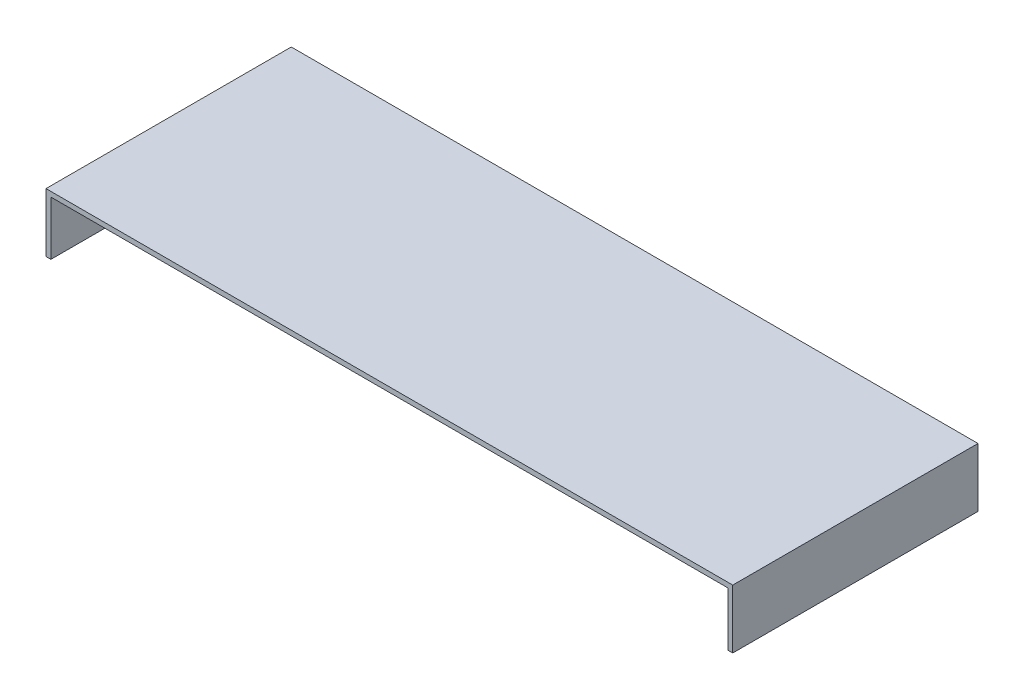
ISO-10303-21;
HEADER;
FILE_DESCRIPTION(('STEP AP214'),'2;1');
FILE_NAME('part.step','',(''),(''),'','','');
FILE_SCHEMA(('AUTOMOTIVE_DESIGN { 1 0 10303 214 1 1 1 1 }'));
ENDSEC;
DATA;
#1=APPLICATION_CONTEXT('core data for automotive mechanical design processes');
#2=APPLICATION_PROTOCOL_DEFINITION('international standard','automotive_design',2000,#1);
#3=PRODUCT_CONTEXT('',#1,'mechanical');
#4=PRODUCT('Part','Part','',(#3));
#5=PRODUCT_RELATED_PRODUCT_CATEGORY('part','',(#4));
#6=PRODUCT_DEFINITION_FORMATION('','',#4);
#7=PRODUCT_DEFINITION_CONTEXT('part definition',#1,'design');
#8=PRODUCT_DEFINITION('design','',#6,#7);
#9=PRODUCT_DEFINITION_SHAPE('','',#8);
#10=(LENGTH_UNIT() NAMED_UNIT(*) SI_UNIT(.MILLI.,.METRE.));
#11=(NAMED_UNIT(*) PLANE_ANGLE_UNIT() SI_UNIT($,.RADIAN.));
#12=(NAMED_UNIT(*) SI_UNIT($,.STERADIAN.) SOLID_ANGLE_UNIT());
#13=UNCERTAINTY_MEASURE_WITH_UNIT(LENGTH_MEASURE(1.E-05),#10,'distance_accuracy_value','');
#14=(GEOMETRIC_REPRESENTATION_CONTEXT(3) GLOBAL_UNCERTAINTY_ASSIGNED_CONTEXT((#13)) GLOBAL_UNIT_ASSIGNED_CONTEXT((#10,
#11,#12)) REPRESENTATION_CONTEXT('',''));
#15=CARTESIAN_POINT('',(0.,0.,0.));
#16=DIRECTION('',(0.,0.,1.));
#17=DIRECTION('',(1.,0.,0.));
#18=AXIS2_PLACEMENT_3D('',#15,#16,#17);
#19=CARTESIAN_POINT('',(0.,0.,0.));
#20=DIRECTION('',(0.,-1.,0.));
#21=DIRECTION('',(0.,0.,-1.));
#22=AXIS2_PLACEMENT_3D('',#19,#20,#21);
#23=PLANE('',#22);
#24=DIRECTION('',(0.,0.,1.));
#25=VECTOR('',#24,1.);
#26=CARTESIAN_POINT('',(-345.,0.,0.));
#27=LINE('',#26,#25);
#28=CARTESIAN_POINT('',(-345.,0.,-125.));
#29=VERTEX_POINT('',#28);
#30=CARTESIAN_POINT('',(-345.,0.,125.));
#31=VERTEX_POINT('',#30);
#32=EDGE_CURVE('E109',#29,#31,#27,.T.);
#33=ORIENTED_EDGE('',*,*,#32,.T.);
#34=DIRECTION('',(1.,0.,0.));
#35=VECTOR('',#34,1.);
#36=CARTESIAN_POINT('',(-350.,0.,125.));
#37=LINE('',#36,#35);
#38=CARTESIAN_POINT('',(-350.,0.,125.));
#39=VERTEX_POINT('',#38);
#40=EDGE_CURVE('E141',#39,#31,#37,.T.);
#41=ORIENTED_EDGE('',*,*,#40,.F.);
#42=DIRECTION('',(0.,0.,1.));
#43=VECTOR('',#42,1.);
#44=CARTESIAN_POINT('',(-350.,0.,125.));
#45=LINE('',#44,#43);
#46=CARTESIAN_POINT('',(-350.,0.,-125.));
#47=VERTEX_POINT('',#46);
#48=EDGE_CURVE('E68',#47,#39,#45,.T.);
#49=ORIENTED_EDGE('',*,*,#48,.F.);
#50=DIRECTION('',(-1.,0.,0.));
#51=VECTOR('',#50,1.);
#52=CARTESIAN_POINT('',(-350.,0.,-125.));
#53=LINE('',#52,#51);
#54=EDGE_CURVE('E124',#29,#47,#53,.T.);
#55=ORIENTED_EDGE('',*,*,#54,.F.);
#56=EDGE_LOOP('',(#33,#41,#49,#55));
#57=FACE_BOUND('',#56,.T.);
#58=ADVANCED_FACE('F33',(#57),#23,.T.);
#59=DIRECTION('',(0.,0.,-1.));
#60=VECTOR('',#59,1.);
#61=CARTESIAN_POINT('',(345.,0.,0.));
#62=LINE('',#61,#60);
#63=CARTESIAN_POINT('',(345.,0.,125.));
#64=VERTEX_POINT('',#63);
#65=CARTESIAN_POINT('',(345.,0.,-125.));
#66=VERTEX_POINT('',#65);
#67=EDGE_CURVE('E121',#64,#66,#62,.T.);
#68=ORIENTED_EDGE('',*,*,#67,.T.);
#69=CARTESIAN_POINT('',(350.,0.,-125.));
#70=VERTEX_POINT('',#69);
#71=EDGE_CURVE('E131',#70,#66,#53,.T.);
#72=ORIENTED_EDGE('',*,*,#71,.F.);
#73=DIRECTION('',(0.,0.,-1.));
#74=VECTOR('',#73,1.);
#75=CARTESIAN_POINT('',(350.,0.,125.));
#76=LINE('',#75,#74);
#77=CARTESIAN_POINT('',(350.,0.,125.));
#78=VERTEX_POINT('',#77);
#79=EDGE_CURVE('E132',#78,#70,#76,.T.);
#80=ORIENTED_EDGE('',*,*,#79,.F.);
#81=EDGE_CURVE('E75',#64,#78,#37,.T.);
#82=ORIENTED_EDGE('',*,*,#81,.F.);
#83=EDGE_LOOP('',(#68,#72,#80,#82));
#84=FACE_BOUND('',#83,.T.);
#85=ADVANCED_FACE('F187',(#84),#23,.T.);
#86=CARTESIAN_POINT('',(350.,60.,125.));
#87=DIRECTION('',(-1.,0.,0.));
#88=DIRECTION('',(0.,0.,1.));
#89=AXIS2_PLACEMENT_3D('',#86,#87,#88);
#90=PLANE('',#89);
#91=ORIENTED_EDGE('',*,*,#79,.T.);
#92=DIRECTION('',(0.,-1.,0.));
#93=VECTOR('',#92,1.);
#94=CARTESIAN_POINT('',(350.,60.,-125.));
#95=LINE('',#94,#93);
#96=CARTESIAN_POINT('',(350.,60.,-125.));
#97=VERTEX_POINT('',#96);
#98=EDGE_CURVE('E11',#97,#70,#95,.T.);
#99=ORIENTED_EDGE('',*,*,#98,.F.);
#100=DIRECTION('',(0.,0.,-1.));
#101=VECTOR('',#100,1.);
#102=CARTESIAN_POINT('',(350.,60.,125.));
#103=LINE('',#102,#101);
#104=CARTESIAN_POINT('',(350.,60.,125.));
#105=VERTEX_POINT('',#104);
#106=EDGE_CURVE('E143',#105,#97,#103,.T.);
#107=ORIENTED_EDGE('',*,*,#106,.F.);
#108=DIRECTION('',(0.,-1.,0.));
#109=VECTOR('',#108,1.);
#110=CARTESIAN_POINT('',(350.,60.,125.));
#111=LINE('',#110,#109);
#112=EDGE_CURVE('E144',#105,#78,#111,.T.);
#113=ORIENTED_EDGE('',*,*,#112,.T.);
#114=EDGE_LOOP('',(#91,#99,#107,#113));
#115=FACE_BOUND('',#114,.T.);
#116=ADVANCED_FACE('F35',(#115),#90,.F.);
#117=CARTESIAN_POINT('',(-350.,60.,-125.));
#118=DIRECTION('',(0.,0.,1.));
#119=DIRECTION('',(1.,0.,0.));
#120=AXIS2_PLACEMENT_3D('',#117,#118,#119);
#121=PLANE('',#120);
#122=DIRECTION('',(-1.,0.,0.));
#123=VECTOR('',#122,1.);
#124=CARTESIAN_POINT('',(-345.,55.,-125.));
#125=LINE('',#124,#123);
#126=CARTESIAN_POINT('',(345.,55.,-125.));
#127=VERTEX_POINT('',#126);
#128=CARTESIAN_POINT('',(-345.,55.,-125.));
#129=VERTEX_POINT('',#128);
#130=EDGE_CURVE('E127',#127,#129,#125,.T.);
#131=ORIENTED_EDGE('',*,*,#130,.T.);
#132=DIRECTION('',(0.,-1.,0.));
#133=VECTOR('',#132,1.);
#134=CARTESIAN_POINT('',(-345.,0.,-125.));
#135=LINE('',#134,#133);
#136=EDGE_CURVE('E112',#129,#29,#135,.T.);
#137=ORIENTED_EDGE('',*,*,#136,.T.);
#138=ORIENTED_EDGE('',*,*,#54,.T.);
#139=DIRECTION('',(0.,-1.,0.));
#140=VECTOR('',#139,1.);
#141=CARTESIAN_POINT('',(-350.,60.,-125.));
#142=LINE('',#141,#140);
#143=CARTESIAN_POINT('',(-350.,60.,-125.));
#144=VERTEX_POINT('',#143);
#145=EDGE_CURVE('E42',#144,#47,#142,.T.);
#146=ORIENTED_EDGE('',*,*,#145,.F.);
#147=DIRECTION('',(-1.,0.,0.));
#148=VECTOR('',#147,1.);
#149=CARTESIAN_POINT('',(-350.,60.,-125.));
#150=LINE('',#149,#148);
#151=EDGE_CURVE('E82',#97,#144,#150,.T.);
#152=ORIENTED_EDGE('',*,*,#151,.F.);
#153=ORIENTED_EDGE('',*,*,#98,.T.);
#154=ORIENTED_EDGE('',*,*,#71,.T.);
#155=DIRECTION('',(0.,1.,0.));
#156=VECTOR('',#155,1.);
#157=CARTESIAN_POINT('',(345.,0.,-125.));
#158=LINE('',#157,#156);
#159=EDGE_CURVE('E128',#66,#127,#158,.T.);
#160=ORIENTED_EDGE('',*,*,#159,.T.);
#161=EDGE_LOOP('',(#131,#137,#138,#146,#152,#153,#154,#160));
#162=FACE_BOUND('',#161,.T.);
#163=ADVANCED_FACE('F123',(#162),#121,.F.);
#164=CARTESIAN_POINT('',(-350.,60.,125.));
#165=DIRECTION('',(1.,0.,0.));
#166=DIRECTION('',(0.,0.,-1.));
#167=AXIS2_PLACEMENT_3D('',#164,#165,#166);
#168=PLANE('',#167);
#169=ORIENTED_EDGE('',*,*,#48,.T.);
#170=DIRECTION('',(0.,-1.,0.));
#171=VECTOR('',#170,1.);
#172=CARTESIAN_POINT('',(-350.,60.,125.));
#173=LINE('',#172,#171);
#174=CARTESIAN_POINT('',(-350.,60.,125.));
#175=VERTEX_POINT('',#174);
#176=EDGE_CURVE('E146',#175,#39,#173,.T.);
#177=ORIENTED_EDGE('',*,*,#176,.F.);
#178=DIRECTION('',(0.,0.,1.));
#179=VECTOR('',#178,1.);
#180=CARTESIAN_POINT('',(-350.,60.,125.));
#181=LINE('',#180,#179);
#182=EDGE_CURVE('E149',#144,#175,#181,.T.);
#183=ORIENTED_EDGE('',*,*,#182,.F.);
#184=ORIENTED_EDGE('',*,*,#145,.T.);
#185=EDGE_LOOP('',(#169,#177,#183,#184));
#186=FACE_BOUND('',#185,.T.);
#187=ADVANCED_FACE('F148',(#186),#168,.F.);
#188=CARTESIAN_POINT('',(-350.,60.,125.));
#189=DIRECTION('',(0.,0.,-1.));
#190=DIRECTION('',(-1.,0.,0.));
#191=AXIS2_PLACEMENT_3D('',#188,#189,#190);
#192=PLANE('',#191);
#193=ORIENTED_EDGE('',*,*,#40,.T.);
#194=DIRECTION('',(0.,-1.,0.));
#195=VECTOR('',#194,1.);
#196=CARTESIAN_POINT('',(-345.,0.,125.));
#197=LINE('',#196,#195);
#198=CARTESIAN_POINT('',(-345.,55.,125.));
#199=VERTEX_POINT('',#198);
#200=EDGE_CURVE('E115',#199,#31,#197,.T.);
#201=ORIENTED_EDGE('',*,*,#200,.F.);
#202=DIRECTION('',(-1.,0.,0.));
#203=VECTOR('',#202,1.);
#204=CARTESIAN_POINT('',(-345.,55.,125.));
#205=LINE('',#204,#203);
#206=CARTESIAN_POINT('',(345.,55.,125.));
#207=VERTEX_POINT('',#206);
#208=EDGE_CURVE('E129',#207,#199,#205,.T.);
#209=ORIENTED_EDGE('',*,*,#208,.F.);
#210=DIRECTION('',(0.,1.,0.));
#211=VECTOR('',#210,1.);
#212=CARTESIAN_POINT('',(345.,0.,125.));
#213=LINE('',#212,#211);
#214=EDGE_CURVE('E159',#64,#207,#213,.T.);
#215=ORIENTED_EDGE('',*,*,#214,.F.);
#216=ORIENTED_EDGE('',*,*,#81,.T.);
#217=ORIENTED_EDGE('',*,*,#112,.F.);
#218=DIRECTION('',(1.,0.,0.));
#219=VECTOR('',#218,1.);
#220=CARTESIAN_POINT('',(-350.,60.,125.));
#221=LINE('',#220,#219);
#222=EDGE_CURVE('E50',#175,#105,#221,.T.);
#223=ORIENTED_EDGE('',*,*,#222,.F.);
#224=ORIENTED_EDGE('',*,*,#176,.T.);
#225=EDGE_LOOP('',(#193,#201,#209,#215,#216,#217,#223,#224));
#226=FACE_BOUND('',#225,.T.);
#227=ADVANCED_FACE('F170',(#226),#192,.F.);
#228=CARTESIAN_POINT('',(0.,60.,0.));
#229=DIRECTION('',(0.,-1.,0.));
#230=DIRECTION('',(0.,0.,-1.));
#231=AXIS2_PLACEMENT_3D('',#228,#229,#230);
#232=PLANE('',#231);
#233=ORIENTED_EDGE('',*,*,#106,.T.);
#234=ORIENTED_EDGE('',*,*,#151,.T.);
#235=ORIENTED_EDGE('',*,*,#182,.T.);
#236=ORIENTED_EDGE('',*,*,#222,.T.);
#237=EDGE_LOOP('',(#233,#234,#235,#236));
#238=FACE_BOUND('',#237,.T.);
#239=ADVANCED_FACE('F175',(#238),#232,.F.);
#240=CARTESIAN_POINT('',(345.,60.,125.));
#241=DIRECTION('',(-1.,0.,0.));
#242=DIRECTION('',(0.,0.,1.));
#243=AXIS2_PLACEMENT_3D('',#240,#241,#242);
#244=PLANE('',#243);
#245=ORIENTED_EDGE('',*,*,#67,.F.);
#246=ORIENTED_EDGE('',*,*,#214,.T.);
#247=DIRECTION('',(0.,0.,-1.));
#248=VECTOR('',#247,1.);
#249=CARTESIAN_POINT('',(345.,55.,0.));
#250=LINE('',#249,#248);
#251=EDGE_CURVE('E120',#207,#127,#250,.T.);
#252=ORIENTED_EDGE('',*,*,#251,.T.);
#253=ORIENTED_EDGE('',*,*,#159,.F.);
#254=EDGE_LOOP('',(#245,#246,#252,#253));
#255=FACE_BOUND('',#254,.T.);
#256=ADVANCED_FACE('F166',(#255),#244,.T.);
#257=CARTESIAN_POINT('',(-345.,60.,125.));
#258=DIRECTION('',(1.,0.,0.));
#259=DIRECTION('',(0.,0.,-1.));
#260=AXIS2_PLACEMENT_3D('',#257,#258,#259);
#261=PLANE('',#260);
#262=ORIENTED_EDGE('',*,*,#32,.F.);
#263=ORIENTED_EDGE('',*,*,#136,.F.);
#264=DIRECTION('',(0.,0.,1.));
#265=VECTOR('',#264,1.);
#266=CARTESIAN_POINT('',(-345.,55.,0.));
#267=LINE('',#266,#265);
#268=EDGE_CURVE('E136',#129,#199,#267,.T.);
#269=ORIENTED_EDGE('',*,*,#268,.T.);
#270=ORIENTED_EDGE('',*,*,#200,.T.);
#271=EDGE_LOOP('',(#262,#263,#269,#270));
#272=FACE_BOUND('',#271,.T.);
#273=ADVANCED_FACE('F111',(#272),#261,.T.);
#274=CARTESIAN_POINT('',(0.,55.,0.));
#275=DIRECTION('',(0.,-1.,0.));
#276=DIRECTION('',(0.,0.,-1.));
#277=AXIS2_PLACEMENT_3D('',#274,#275,#276);
#278=PLANE('',#277);
#279=ORIENTED_EDGE('',*,*,#251,.F.);
#280=ORIENTED_EDGE('',*,*,#208,.T.);
#281=ORIENTED_EDGE('',*,*,#268,.F.);
#282=ORIENTED_EDGE('',*,*,#130,.F.);
#283=EDGE_LOOP('',(#279,#280,#281,#282));
#284=FACE_BOUND('',#283,.T.);
#285=ADVANCED_FACE('F169',(#284),#278,.T.);
#286=CLOSED_SHELL('',(#58,#85,#116,#163,#187,#227,#239,#256,#273,#285));
#287=MANIFOLD_SOLID_BREP('B2',#286);
#288=ADVANCED_BREP_SHAPE_REPRESENTATION('',(#18,#287),#14);
#289=SHAPE_DEFINITION_REPRESENTATION(#9,#288);
ENDSEC;
END-ISO-10303-21;
